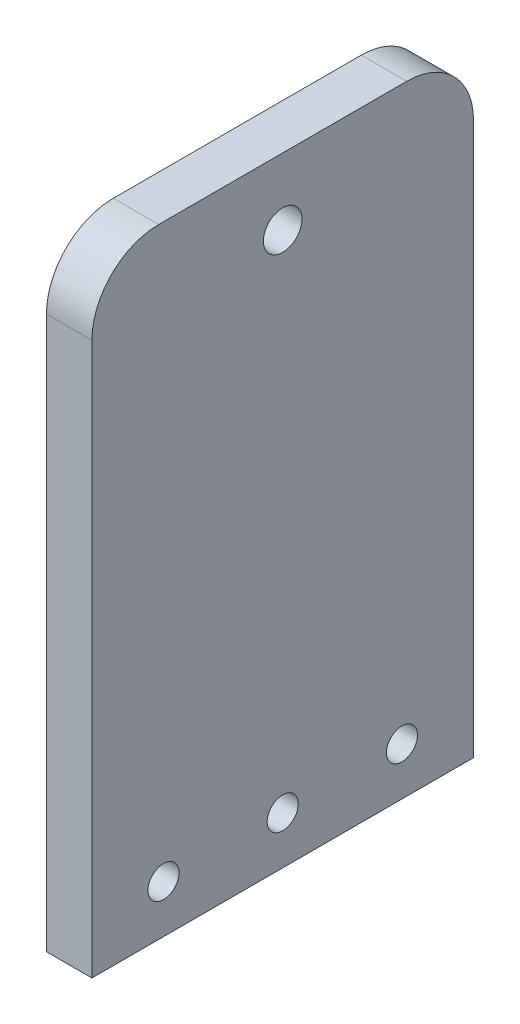
ISO-10303-21;
HEADER;
FILE_DESCRIPTION(('STEP AP214'),'2;1');
FILE_NAME('part.step','',(''),(''),'','','');
FILE_SCHEMA(('AUTOMOTIVE_DESIGN { 1 0 10303 214 1 1 1 1 }'));
ENDSEC;
DATA;
#1=APPLICATION_CONTEXT('core data for automotive mechanical design processes');
#2=APPLICATION_PROTOCOL_DEFINITION('international standard','automotive_design',2000,#1);
#3=PRODUCT_CONTEXT('',#1,'mechanical');
#4=PRODUCT('Part','Part','',(#3));
#5=PRODUCT_RELATED_PRODUCT_CATEGORY('part','',(#4));
#6=PRODUCT_DEFINITION_FORMATION('','',#4);
#7=PRODUCT_DEFINITION_CONTEXT('part definition',#1,'design');
#8=PRODUCT_DEFINITION('design','',#6,#7);
#9=PRODUCT_DEFINITION_SHAPE('','',#8);
#10=(LENGTH_UNIT() NAMED_UNIT(*) SI_UNIT(.MILLI.,.METRE.));
#11=(NAMED_UNIT(*) PLANE_ANGLE_UNIT() SI_UNIT($,.RADIAN.));
#12=(NAMED_UNIT(*) SI_UNIT($,.STERADIAN.) SOLID_ANGLE_UNIT());
#13=UNCERTAINTY_MEASURE_WITH_UNIT(LENGTH_MEASURE(1.E-05),#10,'distance_accuracy_value','');
#14=(GEOMETRIC_REPRESENTATION_CONTEXT(3) GLOBAL_UNCERTAINTY_ASSIGNED_CONTEXT((#13)) GLOBAL_UNIT_ASSIGNED_CONTEXT((#10,
#11,#12)) REPRESENTATION_CONTEXT('',''));
#15=CARTESIAN_POINT('',(0.,0.,0.));
#16=DIRECTION('',(0.,0.,1.));
#17=DIRECTION('',(1.,0.,0.));
#18=AXIS2_PLACEMENT_3D('',#15,#16,#17);
#19=CARTESIAN_POINT('',(4.7625,57.9,-7.));
#20=DIRECTION('',(-1.,0.,0.));
#21=DIRECTION('',(0.,0.,1.));
#22=AXIS2_PLACEMENT_3D('',#19,#20,#21);
#23=CYLINDRICAL_SURFACE('',#22,7.);
#24=CARTESIAN_POINT('',(0.,57.9,-7.));
#25=DIRECTION('',(1.,0.,0.));
#26=DIRECTION('',(0.,0.,-1.));
#27=AXIS2_PLACEMENT_3D('',#24,#25,#26);
#28=CIRCLE('',#27,7.);
#29=CARTESIAN_POINT('',(0.,57.9,0.));
#30=VERTEX_POINT('',#29);
#31=CARTESIAN_POINT('',(0.,64.9,-7.));
#32=VERTEX_POINT('',#31);
#33=EDGE_CURVE('E118',#30,#32,#28,.F.);
#34=ORIENTED_EDGE('',*,*,#33,.F.);
#35=DIRECTION('',(-1.,0.,0.));
#36=VECTOR('',#35,1.);
#37=CARTESIAN_POINT('',(4.7625,57.9,0.));
#38=LINE('',#37,#36);
#39=CARTESIAN_POINT('',(4.7625,57.9,0.));
#40=VERTEX_POINT('',#39);
#41=EDGE_CURVE('E11',#40,#30,#38,.T.);
#42=ORIENTED_EDGE('',*,*,#41,.F.);
#43=CARTESIAN_POINT('',(4.7625,57.9,-7.));
#44=DIRECTION('',(1.,0.,0.));
#45=DIRECTION('',(0.,0.,-1.));
#46=AXIS2_PLACEMENT_3D('',#43,#44,#45);
#47=CIRCLE('',#46,7.);
#48=CARTESIAN_POINT('',(4.7625,64.9,-7.));
#49=VERTEX_POINT('',#48);
#50=EDGE_CURVE('E132',#40,#49,#47,.F.);
#51=ORIENTED_EDGE('',*,*,#50,.T.);
#52=DIRECTION('',(-1.,0.,0.));
#53=VECTOR('',#52,1.);
#54=CARTESIAN_POINT('',(4.7625,64.9,-7.));
#55=LINE('',#54,#53);
#56=EDGE_CURVE('E52',#49,#32,#55,.T.);
#57=ORIENTED_EDGE('',*,*,#56,.T.);
#58=EDGE_LOOP('',(#34,#42,#51,#57));
#59=FACE_BOUND('',#58,.T.);
#60=ADVANCED_FACE('F35',(#59),#23,.T.);
#61=CARTESIAN_POINT('',(4.7625,0.,0.));
#62=DIRECTION('',(0.,0.,1.));
#63=DIRECTION('',(1.,0.,0.));
#64=AXIS2_PLACEMENT_3D('',#61,#62,#63);
#65=PLANE('',#64);
#66=DIRECTION('',(0.,1.,0.));
#67=VECTOR('',#66,1.);
#68=CARTESIAN_POINT('',(0.,0.,0.));
#69=LINE('',#68,#67);
#70=CARTESIAN_POINT('',(0.,0.,0.));
#71=VERTEX_POINT('',#70);
#72=EDGE_CURVE('E120',#71,#30,#69,.T.);
#73=ORIENTED_EDGE('',*,*,#72,.F.);
#74=DIRECTION('',(-1.,0.,0.));
#75=VECTOR('',#74,1.);
#76=CARTESIAN_POINT('',(4.7625,0.,0.));
#77=LINE('',#76,#75);
#78=CARTESIAN_POINT('',(4.7625,0.,0.));
#79=VERTEX_POINT('',#78);
#80=EDGE_CURVE('E44',#79,#71,#77,.T.);
#81=ORIENTED_EDGE('',*,*,#80,.F.);
#82=DIRECTION('',(0.,1.,0.));
#83=VECTOR('',#82,1.);
#84=CARTESIAN_POINT('',(4.7625,0.,0.));
#85=LINE('',#84,#83);
#86=EDGE_CURVE('E145',#79,#40,#85,.T.);
#87=ORIENTED_EDGE('',*,*,#86,.T.);
#88=ORIENTED_EDGE('',*,*,#41,.T.);
#89=EDGE_LOOP('',(#73,#81,#87,#88));
#90=FACE_BOUND('',#89,.T.);
#91=ADVANCED_FACE('F144',(#90),#65,.T.);
#92=CARTESIAN_POINT('',(4.7625,0.,0.));
#93=DIRECTION('',(0.,1.,0.));
#94=DIRECTION('',(0.,0.,1.));
#95=AXIS2_PLACEMENT_3D('',#92,#93,#94);
#96=PLANE('',#95);
#97=DIRECTION('',(0.,0.,-1.));
#98=VECTOR('',#97,1.);
#99=CARTESIAN_POINT('',(0.,0.,0.));
#100=LINE('',#99,#98);
#101=CARTESIAN_POINT('',(0.,0.,-40.));
#102=VERTEX_POINT('',#101);
#103=EDGE_CURVE('E124',#71,#102,#100,.T.);
#104=ORIENTED_EDGE('',*,*,#103,.T.);
#105=DIRECTION('',(-1.,0.,0.));
#106=VECTOR('',#105,1.);
#107=CARTESIAN_POINT('',(4.7625,0.,-40.));
#108=LINE('',#107,#106);
#109=CARTESIAN_POINT('',(4.7625,0.,-40.));
#110=VERTEX_POINT('',#109);
#111=EDGE_CURVE('E110',#110,#102,#108,.T.);
#112=ORIENTED_EDGE('',*,*,#111,.F.);
#113=DIRECTION('',(0.,0.,-1.));
#114=VECTOR('',#113,1.);
#115=CARTESIAN_POINT('',(4.7625,0.,0.));
#116=LINE('',#115,#114);
#117=EDGE_CURVE('E98',#79,#110,#116,.T.);
#118=ORIENTED_EDGE('',*,*,#117,.F.);
#119=ORIENTED_EDGE('',*,*,#80,.T.);
#120=EDGE_LOOP('',(#104,#112,#118,#119));
#121=FACE_BOUND('',#120,.T.);
#122=ADVANCED_FACE('F138',(#121),#96,.F.);
#123=CARTESIAN_POINT('',(4.7625,0.,-40.));
#124=DIRECTION('',(0.,0.,1.));
#125=DIRECTION('',(0.,-1.,0.));
#126=AXIS2_PLACEMENT_3D('',#123,#124,#125);
#127=PLANE('',#126);
#128=DIRECTION('',(0.,1.,0.));
#129=VECTOR('',#128,1.);
#130=CARTESIAN_POINT('',(0.,0.,-40.));
#131=LINE('',#130,#129);
#132=CARTESIAN_POINT('',(0.,57.9,-40.));
#133=VERTEX_POINT('',#132);
#134=EDGE_CURVE('E107',#102,#133,#131,.T.);
#135=ORIENTED_EDGE('',*,*,#134,.T.);
#136=DIRECTION('',(-1.,0.,0.));
#137=VECTOR('',#136,1.);
#138=CARTESIAN_POINT('',(4.7625,57.9,-40.));
#139=LINE('',#138,#137);
#140=CARTESIAN_POINT('',(4.7625,57.9,-40.));
#141=VERTEX_POINT('',#140);
#142=EDGE_CURVE('E104',#141,#133,#139,.T.);
#143=ORIENTED_EDGE('',*,*,#142,.F.);
#144=DIRECTION('',(0.,1.,0.));
#145=VECTOR('',#144,1.);
#146=CARTESIAN_POINT('',(4.7625,0.,-40.));
#147=LINE('',#146,#145);
#148=EDGE_CURVE('E90',#110,#141,#147,.T.);
#149=ORIENTED_EDGE('',*,*,#148,.F.);
#150=ORIENTED_EDGE('',*,*,#111,.T.);
#151=EDGE_LOOP('',(#135,#143,#149,#150));
#152=FACE_BOUND('',#151,.T.);
#153=ADVANCED_FACE('F105',(#152),#127,.F.);
#154=CARTESIAN_POINT('',(4.7625,57.9,-33.));
#155=DIRECTION('',(-1.,0.,0.));
#156=DIRECTION('',(0.,0.,1.));
#157=AXIS2_PLACEMENT_3D('',#154,#155,#156);
#158=CYLINDRICAL_SURFACE('',#157,7.);
#159=CARTESIAN_POINT('',(0.,57.9,-33.));
#160=DIRECTION('',(1.,0.,0.));
#161=DIRECTION('',(0.,0.,-1.));
#162=AXIS2_PLACEMENT_3D('',#159,#160,#161);
#163=CIRCLE('',#162,7.);
#164=CARTESIAN_POINT('',(0.,64.9,-33.));
#165=VERTEX_POINT('',#164);
#166=EDGE_CURVE('E127',#165,#133,#163,.F.);
#167=ORIENTED_EDGE('',*,*,#166,.F.);
#168=DIRECTION('',(-1.,0.,0.));
#169=VECTOR('',#168,1.);
#170=CARTESIAN_POINT('',(4.7625,64.9,-33.));
#171=LINE('',#170,#169);
#172=CARTESIAN_POINT('',(4.7625,64.9,-33.));
#173=VERTEX_POINT('',#172);
#174=EDGE_CURVE('E71',#173,#165,#171,.T.);
#175=ORIENTED_EDGE('',*,*,#174,.F.);
#176=CARTESIAN_POINT('',(4.7625,57.9,-33.));
#177=DIRECTION('',(1.,0.,0.));
#178=DIRECTION('',(0.,0.,-1.));
#179=AXIS2_PLACEMENT_3D('',#176,#177,#178);
#180=CIRCLE('',#179,7.);
#181=EDGE_CURVE('E95',#173,#141,#180,.F.);
#182=ORIENTED_EDGE('',*,*,#181,.T.);
#183=ORIENTED_EDGE('',*,*,#142,.T.);
#184=EDGE_LOOP('',(#167,#175,#182,#183));
#185=FACE_BOUND('',#184,.T.);
#186=ADVANCED_FACE('F112',(#185),#158,.T.);
#187=CARTESIAN_POINT('',(4.7625,64.9,0.));
#188=DIRECTION('',(0.,1.,0.));
#189=DIRECTION('',(0.,0.,1.));
#190=AXIS2_PLACEMENT_3D('',#187,#188,#189);
#191=PLANE('',#190);
#192=DIRECTION('',(0.,0.,-1.));
#193=VECTOR('',#192,1.);
#194=CARTESIAN_POINT('',(0.,64.9,0.));
#195=LINE('',#194,#193);
#196=EDGE_CURVE('E129',#32,#165,#195,.T.);
#197=ORIENTED_EDGE('',*,*,#196,.F.);
#198=ORIENTED_EDGE('',*,*,#56,.F.);
#199=DIRECTION('',(0.,0.,-1.));
#200=VECTOR('',#199,1.);
#201=CARTESIAN_POINT('',(4.7625,64.9,0.));
#202=LINE('',#201,#200);
#203=EDGE_CURVE('E113',#49,#173,#202,.T.);
#204=ORIENTED_EDGE('',*,*,#203,.T.);
#205=ORIENTED_EDGE('',*,*,#174,.T.);
#206=EDGE_LOOP('',(#197,#198,#204,#205));
#207=FACE_BOUND('',#206,.T.);
#208=ADVANCED_FACE('F146',(#207),#191,.T.);
#209=CARTESIAN_POINT('',(4.7625,0.,0.));
#210=DIRECTION('',(1.,0.,0.));
#211=DIRECTION('',(0.,0.,-1.));
#212=AXIS2_PLACEMENT_3D('',#209,#210,#211);
#213=PLANE('',#212);
#214=CARTESIAN_POINT('',(4.7625,57.9,-20.));
#215=DIRECTION('',(1.,0.,0.));
#216=DIRECTION('',(0.,0.,-1.));
#217=AXIS2_PLACEMENT_3D('',#214,#215,#216);
#218=CIRCLE('',#217,2.025);
#219=CARTESIAN_POINT('',(4.7625,57.9,-22.025));
#220=VERTEX_POINT('',#219);
#221=EDGE_CURVE('E240',#220,#220,#218,.T.);
#222=ORIENTED_EDGE('',*,*,#221,.F.);
#223=EDGE_LOOP('',(#222));
#224=FACE_BOUND('',#223,.T.);
#225=CARTESIAN_POINT('',(4.7625,5.,-7.5));
#226=DIRECTION('',(1.,0.,0.));
#227=DIRECTION('',(0.,0.,-1.));
#228=AXIS2_PLACEMENT_3D('',#225,#226,#227);
#229=CIRCLE('',#228,1.63195);
#230=CARTESIAN_POINT('',(4.7625,5.,-9.13195));
#231=VERTEX_POINT('',#230);
#232=EDGE_CURVE('E243',#231,#231,#229,.T.);
#233=ORIENTED_EDGE('',*,*,#232,.F.);
#234=EDGE_LOOP('',(#233));
#235=FACE_BOUND('',#234,.T.);
#236=CARTESIAN_POINT('',(4.7625,5.,-20.));
#237=DIRECTION('',(1.,0.,0.));
#238=DIRECTION('',(0.,0.,-1.));
#239=AXIS2_PLACEMENT_3D('',#236,#237,#238);
#240=CIRCLE('',#239,1.63195);
#241=CARTESIAN_POINT('',(4.7625,5.,-21.63195));
#242=VERTEX_POINT('',#241);
#243=EDGE_CURVE('E251',#242,#242,#240,.T.);
#244=ORIENTED_EDGE('',*,*,#243,.F.);
#245=EDGE_LOOP('',(#244));
#246=FACE_BOUND('',#245,.T.);
#247=CARTESIAN_POINT('',(4.7625,5.,-32.5));
#248=DIRECTION('',(1.,0.,0.));
#249=DIRECTION('',(0.,0.,-1.));
#250=AXIS2_PLACEMENT_3D('',#247,#248,#249);
#251=CIRCLE('',#250,1.63195);
#252=CARTESIAN_POINT('',(4.7625,5.,-34.13195));
#253=VERTEX_POINT('',#252);
#254=EDGE_CURVE('E257',#253,#253,#251,.T.);
#255=ORIENTED_EDGE('',*,*,#254,.F.);
#256=EDGE_LOOP('',(#255));
#257=FACE_BOUND('',#256,.T.);
#258=ORIENTED_EDGE('',*,*,#50,.F.);
#259=ORIENTED_EDGE('',*,*,#86,.F.);
#260=ORIENTED_EDGE('',*,*,#117,.T.);
#261=ORIENTED_EDGE('',*,*,#148,.T.);
#262=ORIENTED_EDGE('',*,*,#181,.F.);
#263=ORIENTED_EDGE('',*,*,#203,.F.);
#264=EDGE_LOOP('',(#258,#259,#260,#261,#262,#263));
#265=FACE_BOUND('',#264,.T.);
#266=ADVANCED_FACE('F92',(#224,#235,#246,#257,#265),#213,.T.);
#267=CARTESIAN_POINT('',(0.,0.,0.));
#268=DIRECTION('',(1.,0.,0.));
#269=DIRECTION('',(0.,0.,-1.));
#270=AXIS2_PLACEMENT_3D('',#267,#268,#269);
#271=PLANE('',#270);
#272=CARTESIAN_POINT('',(0.,57.9,-20.));
#273=DIRECTION('',(1.,0.,0.));
#274=DIRECTION('',(0.,0.,-1.));
#275=AXIS2_PLACEMENT_3D('',#272,#273,#274);
#276=CIRCLE('',#275,2.025);
#277=CARTESIAN_POINT('',(0.,57.9,-22.025));
#278=VERTEX_POINT('',#277);
#279=EDGE_CURVE('E38',#278,#278,#276,.T.);
#280=ORIENTED_EDGE('',*,*,#279,.T.);
#281=EDGE_LOOP('',(#280));
#282=FACE_BOUND('',#281,.T.);
#283=CARTESIAN_POINT('',(0.,5.,-7.5));
#284=DIRECTION('',(1.,0.,0.));
#285=DIRECTION('',(0.,0.,-1.));
#286=AXIS2_PLACEMENT_3D('',#283,#284,#285);
#287=CIRCLE('',#286,1.63195);
#288=CARTESIAN_POINT('',(0.,5.,-9.13195));
#289=VERTEX_POINT('',#288);
#290=EDGE_CURVE('E245',#289,#289,#287,.T.);
#291=ORIENTED_EDGE('',*,*,#290,.T.);
#292=EDGE_LOOP('',(#291));
#293=FACE_BOUND('',#292,.T.);
#294=CARTESIAN_POINT('',(0.,5.,-20.));
#295=DIRECTION('',(1.,0.,0.));
#296=DIRECTION('',(0.,0.,-1.));
#297=AXIS2_PLACEMENT_3D('',#294,#295,#296);
#298=CIRCLE('',#297,1.63195);
#299=CARTESIAN_POINT('',(0.,5.,-21.63195));
#300=VERTEX_POINT('',#299);
#301=EDGE_CURVE('E254',#300,#300,#298,.T.);
#302=ORIENTED_EDGE('',*,*,#301,.T.);
#303=EDGE_LOOP('',(#302));
#304=FACE_BOUND('',#303,.T.);
#305=CARTESIAN_POINT('',(0.,5.,-32.5));
#306=DIRECTION('',(1.,0.,0.));
#307=DIRECTION('',(0.,0.,-1.));
#308=AXIS2_PLACEMENT_3D('',#305,#306,#307);
#309=CIRCLE('',#308,1.63195);
#310=CARTESIAN_POINT('',(0.,5.,-34.13195));
#311=VERTEX_POINT('',#310);
#312=EDGE_CURVE('E121',#311,#311,#309,.T.);
#313=ORIENTED_EDGE('',*,*,#312,.T.);
#314=EDGE_LOOP('',(#313));
#315=FACE_BOUND('',#314,.T.);
#316=ORIENTED_EDGE('',*,*,#33,.T.);
#317=ORIENTED_EDGE('',*,*,#196,.T.);
#318=ORIENTED_EDGE('',*,*,#166,.T.);
#319=ORIENTED_EDGE('',*,*,#134,.F.);
#320=ORIENTED_EDGE('',*,*,#103,.F.);
#321=ORIENTED_EDGE('',*,*,#72,.T.);
#322=EDGE_LOOP('',(#316,#317,#318,#319,#320,#321));
#323=FACE_BOUND('',#322,.T.);
#324=ADVANCED_FACE('F143',(#282,#293,#304,#315,#323),#271,.F.);
#325=CARTESIAN_POINT('',(4.7625,5.,-32.5));
#326=DIRECTION('',(1.,0.,0.));
#327=DIRECTION('',(0.,0.,-1.));
#328=AXIS2_PLACEMENT_3D('',#325,#326,#327);
#329=CYLINDRICAL_SURFACE('',#328,1.63195);
#330=ORIENTED_EDGE('',*,*,#312,.F.);
#331=EDGE_LOOP('',(#330));
#332=FACE_BOUND('',#331,.T.);
#333=ORIENTED_EDGE('',*,*,#254,.T.);
#334=EDGE_LOOP('',(#333));
#335=FACE_BOUND('',#334,.T.);
#336=ADVANCED_FACE('F185',(#332,#335),#329,.F.);
#337=CARTESIAN_POINT('',(4.7625,5.,-20.));
#338=DIRECTION('',(1.,0.,0.));
#339=DIRECTION('',(0.,0.,-1.));
#340=AXIS2_PLACEMENT_3D('',#337,#338,#339);
#341=CYLINDRICAL_SURFACE('',#340,1.63195);
#342=ORIENTED_EDGE('',*,*,#301,.F.);
#343=EDGE_LOOP('',(#342));
#344=FACE_BOUND('',#343,.T.);
#345=ORIENTED_EDGE('',*,*,#243,.T.);
#346=EDGE_LOOP('',(#345));
#347=FACE_BOUND('',#346,.T.);
#348=ADVANCED_FACE('F190',(#344,#347),#341,.F.);
#349=CARTESIAN_POINT('',(4.7625,5.,-7.5));
#350=DIRECTION('',(1.,0.,0.));
#351=DIRECTION('',(0.,0.,-1.));
#352=AXIS2_PLACEMENT_3D('',#349,#350,#351);
#353=CYLINDRICAL_SURFACE('',#352,1.63195);
#354=ORIENTED_EDGE('',*,*,#290,.F.);
#355=EDGE_LOOP('',(#354));
#356=FACE_BOUND('',#355,.T.);
#357=ORIENTED_EDGE('',*,*,#232,.T.);
#358=EDGE_LOOP('',(#357));
#359=FACE_BOUND('',#358,.T.);
#360=ADVANCED_FACE('F202',(#356,#359),#353,.F.);
#361=CARTESIAN_POINT('',(-5.2375,57.9,-20.));
#362=DIRECTION('',(1.,0.,0.));
#363=DIRECTION('',(0.,0.,-1.));
#364=AXIS2_PLACEMENT_3D('',#361,#362,#363);
#365=CYLINDRICAL_SURFACE('',#364,2.025);
#366=ORIENTED_EDGE('',*,*,#221,.T.);
#367=EDGE_LOOP('',(#366));
#368=FACE_BOUND('',#367,.T.);
#369=ORIENTED_EDGE('',*,*,#279,.F.);
#370=EDGE_LOOP('',(#369));
#371=FACE_BOUND('',#370,.T.);
#372=ADVANCED_FACE('F212',(#368,#371),#365,.F.);
#373=CLOSED_SHELL('',(#60,#91,#122,#153,#186,#208,#266,#324,#336,#348,#360,#372));
#374=MANIFOLD_SOLID_BREP('B2',#373);
#375=ADVANCED_BREP_SHAPE_REPRESENTATION('',(#18,#374),#14);
#376=SHAPE_DEFINITION_REPRESENTATION(#9,#375);
ENDSEC;
END-ISO-10303-21;
